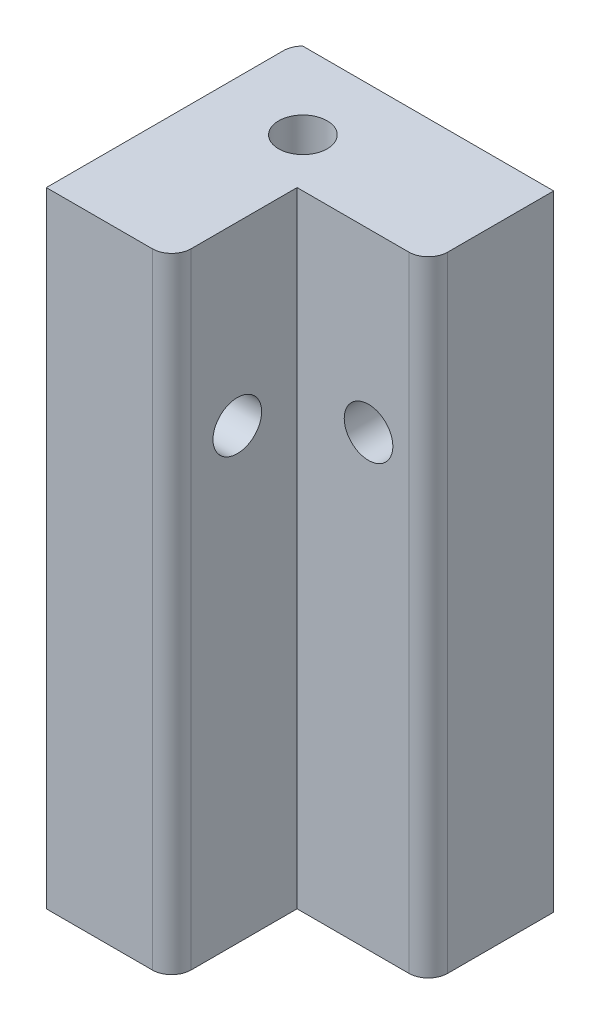
ISO-10303-21;
HEADER;
FILE_DESCRIPTION(('STEP AP214'),'2;1');
FILE_NAME('part.step','',(''),(''),'','','');
FILE_SCHEMA(('AUTOMOTIVE_DESIGN { 1 0 10303 214 1 1 1 1 }'));
ENDSEC;
DATA;
#1=APPLICATION_CONTEXT('core data for automotive mechanical design processes');
#2=APPLICATION_PROTOCOL_DEFINITION('international standard','automotive_design',2000,#1);
#3=PRODUCT_CONTEXT('',#1,'mechanical');
#4=PRODUCT('Part','Part','',(#3));
#5=PRODUCT_RELATED_PRODUCT_CATEGORY('part','',(#4));
#6=PRODUCT_DEFINITION_FORMATION('','',#4);
#7=PRODUCT_DEFINITION_CONTEXT('part definition',#1,'design');
#8=PRODUCT_DEFINITION('design','',#6,#7);
#9=PRODUCT_DEFINITION_SHAPE('','',#8);
#10=(LENGTH_UNIT() NAMED_UNIT(*) SI_UNIT(.MILLI.,.METRE.));
#11=(NAMED_UNIT(*) PLANE_ANGLE_UNIT() SI_UNIT($,.RADIAN.));
#12=(NAMED_UNIT(*) SI_UNIT($,.STERADIAN.) SOLID_ANGLE_UNIT());
#13=UNCERTAINTY_MEASURE_WITH_UNIT(LENGTH_MEASURE(1.E-05),#10,'distance_accuracy_value','');
#14=(GEOMETRIC_REPRESENTATION_CONTEXT(3) GLOBAL_UNCERTAINTY_ASSIGNED_CONTEXT((#13)) GLOBAL_UNIT_ASSIGNED_CONTEXT((#10,
#11,#12)) REPRESENTATION_CONTEXT('',''));
#15=CARTESIAN_POINT('',(0.,0.,0.));
#16=DIRECTION('',(0.,0.,1.));
#17=DIRECTION('',(1.,0.,0.));
#18=AXIS2_PLACEMENT_3D('',#15,#16,#17);
#19=CARTESIAN_POINT('',(4.4,82.5133549546154,-8.5));
#20=DIRECTION('',(-1.,0.,0.));
#21=DIRECTION('',(0.,0.,1.));
#22=AXIS2_PLACEMENT_3D('',#19,#20,#21);
#23=PLANE('',#22);
#24=CARTESIAN_POINT('',(4.4,46.1350000000003,11.15));
#25=DIRECTION('',(-1.,0.,0.));
#26=DIRECTION('',(0.,0.,1.));
#27=AXIS2_PLACEMENT_3D('',#24,#25,#26);
#28=CIRCLE('',#27,2.5);
#29=CARTESIAN_POINT('',(4.4,46.1350000000003,13.65));
#30=VERTEX_POINT('',#29);
#31=EDGE_CURVE('E173',#30,#30,#28,.T.);
#32=ORIENTED_EDGE('',*,*,#31,.T.);
#33=EDGE_LOOP('',(#32));
#34=FACE_BOUND('',#33,.T.);
#35=DIRECTION('',(0.,-1.,0.));
#36=VECTOR('',#35,1.);
#37=CARTESIAN_POINT('',(4.4,64.2700000000025,5.));
#38=LINE('',#37,#36);
#39=CARTESIAN_POINT('',(4.4,64.2700000000025,5.));
#40=VERTEX_POINT('',#39);
#41=CARTESIAN_POINT('',(4.4,0.,4.99999999999999));
#42=VERTEX_POINT('',#41);
#43=EDGE_CURVE('E159',#40,#42,#38,.T.);
#44=ORIENTED_EDGE('',*,*,#43,.F.);
#45=DIRECTION('',(0.,0.,1.));
#46=VECTOR('',#45,1.);
#47=CARTESIAN_POINT('',(4.4,64.2700000000025,-8.50000000000006));
#48=LINE('',#47,#46);
#49=CARTESIAN_POINT('',(4.4,64.2700000000024,15.9));
#50=VERTEX_POINT('',#49);
#51=EDGE_CURVE('E194',#40,#50,#48,.T.);
#52=ORIENTED_EDGE('',*,*,#51,.T.);
#53=DIRECTION('',(0.,1.,0.));
#54=VECTOR('',#53,1.);
#55=CARTESIAN_POINT('',(4.4,82.5133549546154,15.9));
#56=LINE('',#55,#54);
#57=CARTESIAN_POINT('',(4.4,0.,15.9));
#58=VERTEX_POINT('',#57);
#59=EDGE_CURVE('E219',#50,#58,#56,.F.);
#60=ORIENTED_EDGE('',*,*,#59,.T.);
#61=DIRECTION('',(0.,0.,-1.));
#62=VECTOR('',#61,1.);
#63=CARTESIAN_POINT('',(4.4,0.,-8.5));
#64=LINE('',#63,#62);
#65=EDGE_CURVE('E189',#58,#42,#64,.T.);
#66=ORIENTED_EDGE('',*,*,#65,.T.);
#67=EDGE_LOOP('',(#44,#52,#60,#66));
#68=FACE_BOUND('',#67,.T.);
#69=ADVANCED_FACE('F40',(#34,#68),#23,.F.);
#70=CARTESIAN_POINT('',(0.,0.,0.));
#71=DIRECTION('',(0.,-1.,0.));
#72=DIRECTION('',(0.,0.,-1.));
#73=AXIS2_PLACEMENT_3D('',#70,#71,#72);
#74=PLANE('',#73);
#75=DIRECTION('',(1.,0.,0.));
#76=VECTOR('',#75,1.);
#77=CARTESIAN_POINT('',(17.9000000000003,0.,-7.90000000000023));
#78=LINE('',#77,#76);
#79=CARTESIAN_POINT('',(-7.92828568570863,0.,-7.90000000000022));
#80=VERTEX_POINT('',#79);
#81=CARTESIAN_POINT('',(17.9000000000003,0.,-7.90000000000023));
#82=VERTEX_POINT('',#81);
#83=EDGE_CURVE('E129',#80,#82,#78,.T.);
#84=ORIENTED_EDGE('',*,*,#83,.T.);
#85=DIRECTION('',(0.,0.,-1.));
#86=VECTOR('',#85,1.);
#87=CARTESIAN_POINT('',(17.9,0.,-8.5));
#88=LINE('',#87,#86);
#89=CARTESIAN_POINT('',(17.9,0.,2.99999999999999));
#90=VERTEX_POINT('',#89);
#91=EDGE_CURVE('E141',#90,#82,#88,.T.);
#92=ORIENTED_EDGE('',*,*,#91,.F.);
#93=CARTESIAN_POINT('',(15.9,0.,2.99999999999999));
#94=DIRECTION('',(0.,-1.,0.));
#95=DIRECTION('',(0.,0.,-1.));
#96=AXIS2_PLACEMENT_3D('',#93,#94,#95);
#97=CIRCLE('',#96,2.);
#98=CARTESIAN_POINT('',(15.9,0.,4.99999999999999));
#99=VERTEX_POINT('',#98);
#100=EDGE_CURVE('E233',#90,#99,#97,.T.);
#101=ORIENTED_EDGE('',*,*,#100,.T.);
#102=DIRECTION('',(-1.,0.,0.));
#103=VECTOR('',#102,1.);
#104=CARTESIAN_POINT('',(17.9,0.,4.99999999999999));
#105=LINE('',#104,#103);
#106=EDGE_CURVE('E151',#99,#42,#105,.T.);
#107=ORIENTED_EDGE('',*,*,#106,.T.);
#108=ORIENTED_EDGE('',*,*,#65,.F.);
#109=CARTESIAN_POINT('',(2.4,0.,15.9));
#110=DIRECTION('',(0.,-1.,0.));
#111=DIRECTION('',(0.,0.,-1.));
#112=AXIS2_PLACEMENT_3D('',#109,#110,#111);
#113=CIRCLE('',#112,2.);
#114=CARTESIAN_POINT('',(2.4,0.,17.9));
#115=VERTEX_POINT('',#114);
#116=EDGE_CURVE('E224',#58,#115,#113,.T.);
#117=ORIENTED_EDGE('',*,*,#116,.T.);
#118=DIRECTION('',(1.,0.,0.));
#119=VECTOR('',#118,1.);
#120=CARTESIAN_POINT('',(4.4,0.,17.9));
#121=LINE('',#120,#119);
#122=CARTESIAN_POINT('',(-8.5,0.,17.9));
#123=VERTEX_POINT('',#122);
#124=EDGE_CURVE('E181',#123,#115,#121,.T.);
#125=ORIENTED_EDGE('',*,*,#124,.F.);
#126=DIRECTION('',(0.,0.,1.));
#127=VECTOR('',#126,1.);
#128=CARTESIAN_POINT('',(-8.5,0.,4.4));
#129=LINE('',#128,#127);
#130=CARTESIAN_POINT('',(-8.5,0.,-6.5));
#131=VERTEX_POINT('',#130);
#132=EDGE_CURVE('E195',#131,#123,#129,.T.);
#133=ORIENTED_EDGE('',*,*,#132,.F.);
#134=CARTESIAN_POINT('',(-6.5,0.,-6.5));
#135=DIRECTION('',(0.,-1.,0.));
#136=DIRECTION('',(0.,0.,-1.));
#137=AXIS2_PLACEMENT_3D('',#134,#135,#136);
#138=CIRCLE('',#137,2.);
#139=EDGE_CURVE('E143',#131,#80,#138,.T.);
#140=ORIENTED_EDGE('',*,*,#139,.T.);
#141=EDGE_LOOP('',(#84,#92,#101,#107,#108,#117,#125,#133,#140));
#142=FACE_BOUND('',#141,.T.);
#143=CARTESIAN_POINT('',(0.,0.,0.));
#144=DIRECTION('',(0.,1.,0.));
#145=DIRECTION('',(0.,0.,1.));
#146=AXIS2_PLACEMENT_3D('',#143,#144,#145);
#147=CIRCLE('',#146,2.5);
#148=CARTESIAN_POINT('',(0.,0.,2.5));
#149=VERTEX_POINT('',#148);
#150=EDGE_CURVE('E188',#149,#149,#147,.T.);
#151=ORIENTED_EDGE('',*,*,#150,.T.);
#152=EDGE_LOOP('',(#151));
#153=FACE_BOUND('',#152,.T.);
#154=ADVANCED_FACE('F139',(#142,#153),#74,.T.);
#155=CARTESIAN_POINT('',(-8.5,82.5133549546154,4.4));
#156=DIRECTION('',(1.,0.,0.));
#157=DIRECTION('',(0.,0.,-1.));
#158=AXIS2_PLACEMENT_3D('',#155,#156,#157);
#159=PLANE('',#158);
#160=CARTESIAN_POINT('',(-8.5,46.1350000000003,11.15));
#161=DIRECTION('',(-1.,0.,0.));
#162=DIRECTION('',(0.,0.,1.));
#163=AXIS2_PLACEMENT_3D('',#160,#161,#162);
#164=CIRCLE('',#163,2.5);
#165=CARTESIAN_POINT('',(-8.5,46.1350000000003,13.65));
#166=VERTEX_POINT('',#165);
#167=EDGE_CURVE('E169',#166,#166,#164,.T.);
#168=ORIENTED_EDGE('',*,*,#167,.F.);
#169=EDGE_LOOP('',(#168));
#170=FACE_BOUND('',#169,.T.);
#171=DIRECTION('',(0.,0.,-1.));
#172=VECTOR('',#171,1.);
#173=CARTESIAN_POINT('',(-8.5,64.2700000000024,4.39999999999994));
#174=LINE('',#173,#172);
#175=CARTESIAN_POINT('',(-8.5,64.2700000000024,17.9));
#176=VERTEX_POINT('',#175);
#177=CARTESIAN_POINT('',(-8.5,64.2700000000025,-6.5));
#178=VERTEX_POINT('',#177);
#179=EDGE_CURVE('E198',#176,#178,#174,.T.);
#180=ORIENTED_EDGE('',*,*,#179,.T.);
#181=DIRECTION('',(0.,-1.,0.));
#182=VECTOR('',#181,1.);
#183=CARTESIAN_POINT('',(-8.5,82.5133549546154,-6.5));
#184=LINE('',#183,#182);
#185=EDGE_CURVE('E227',#178,#131,#184,.T.);
#186=ORIENTED_EDGE('',*,*,#185,.T.);
#187=ORIENTED_EDGE('',*,*,#132,.T.);
#188=DIRECTION('',(0.,-1.,0.));
#189=VECTOR('',#188,1.);
#190=CARTESIAN_POINT('',(-8.5,0.,17.9));
#191=LINE('',#190,#189);
#192=EDGE_CURVE('E177',#176,#123,#191,.T.);
#193=ORIENTED_EDGE('',*,*,#192,.F.);
#194=EDGE_LOOP('',(#180,#186,#187,#193));
#195=FACE_BOUND('',#194,.T.);
#196=ADVANCED_FACE('F265',(#170,#195),#159,.F.);
#197=CARTESIAN_POINT('',(0.,82.5133549546154,0.));
#198=DIRECTION('',(0.,-1.,0.));
#199=DIRECTION('',(0.,0.,-1.));
#200=AXIS2_PLACEMENT_3D('',#197,#198,#199);
#201=CYLINDRICAL_SURFACE('',#200,2.5);
#202=CARTESIAN_POINT('',(0.,64.2700000000025,0.));
#203=DIRECTION('',(0.,-1.,0.));
#204=DIRECTION('',(0.,0.,-1.));
#205=AXIS2_PLACEMENT_3D('',#202,#203,#204);
#206=CIRCLE('',#205,2.5);
#207=CARTESIAN_POINT('',(0.,64.2700000000025,-2.5));
#208=VERTEX_POINT('',#207);
#209=EDGE_CURVE('E193',#208,#208,#206,.T.);
#210=ORIENTED_EDGE('',*,*,#209,.F.);
#211=EDGE_LOOP('',(#210));
#212=FACE_BOUND('',#211,.T.);
#213=ORIENTED_EDGE('',*,*,#150,.F.);
#214=EDGE_LOOP('',(#213));
#215=FACE_BOUND('',#214,.T.);
#216=ADVANCED_FACE('F272',(#212,#215),#201,.F.);
#217=CARTESIAN_POINT('',(-5.03553390591879,64.2700000000017,230.321777316259));
#218=DIRECTION('',(0.,-1.,0.));
#219=DIRECTION('',(-1.,0.,0.));
#220=AXIS2_PLACEMENT_3D('',#217,#218,#219);
#221=PLANE('',#220);
#222=ORIENTED_EDGE('',*,*,#209,.T.);
#223=EDGE_LOOP('',(#222));
#224=FACE_BOUND('',#223,.T.);
#225=DIRECTION('',(0.,0.,1.));
#226=VECTOR('',#225,1.);
#227=CARTESIAN_POINT('',(17.9,64.2700000000025,-8.5));
#228=LINE('',#227,#226);
#229=CARTESIAN_POINT('',(17.9,64.2700000000025,-7.90000000000011));
#230=VERTEX_POINT('',#229);
#231=CARTESIAN_POINT('',(17.9,64.2700000000025,3.));
#232=VERTEX_POINT('',#231);
#233=EDGE_CURVE('E152',#230,#232,#228,.T.);
#234=ORIENTED_EDGE('',*,*,#233,.F.);
#235=DIRECTION('',(1.,0.,0.));
#236=VECTOR('',#235,1.);
#237=CARTESIAN_POINT('',(17.9,64.2700000000026,-7.9));
#238=LINE('',#237,#236);
#239=CARTESIAN_POINT('',(-7.92828568570863,64.2700000000025,-7.9));
#240=VERTEX_POINT('',#239);
#241=EDGE_CURVE('E57',#240,#230,#238,.T.);
#242=ORIENTED_EDGE('',*,*,#241,.F.);
#243=CARTESIAN_POINT('',(-6.5,64.2700000000025,-6.5));
#244=DIRECTION('',(0.,-1.,0.));
#245=DIRECTION('',(0.,0.,-1.));
#246=AXIS2_PLACEMENT_3D('',#243,#244,#245);
#247=CIRCLE('',#246,2.);
#248=EDGE_CURVE('E213',#240,#178,#247,.F.);
#249=ORIENTED_EDGE('',*,*,#248,.T.);
#250=ORIENTED_EDGE('',*,*,#179,.F.);
#251=DIRECTION('',(-1.,0.,0.));
#252=VECTOR('',#251,1.);
#253=CARTESIAN_POINT('',(-8.5,64.2700000000024,17.9));
#254=LINE('',#253,#252);
#255=CARTESIAN_POINT('',(2.4,64.2700000000025,17.9));
#256=VERTEX_POINT('',#255);
#257=EDGE_CURVE('E185',#256,#176,#254,.T.);
#258=ORIENTED_EDGE('',*,*,#257,.F.);
#259=CARTESIAN_POINT('',(2.4,64.2700000000024,15.9));
#260=DIRECTION('',(0.,-1.,0.));
#261=DIRECTION('',(0.,0.,-1.));
#262=AXIS2_PLACEMENT_3D('',#259,#260,#261);
#263=CIRCLE('',#262,2.);
#264=EDGE_CURVE('E215',#256,#50,#263,.F.);
#265=ORIENTED_EDGE('',*,*,#264,.T.);
#266=ORIENTED_EDGE('',*,*,#51,.F.);
#267=DIRECTION('',(-1.,0.,0.));
#268=VECTOR('',#267,1.);
#269=CARTESIAN_POINT('',(17.9,64.2700000000025,5.));
#270=LINE('',#269,#268);
#271=CARTESIAN_POINT('',(15.9,64.2700000000025,5.));
#272=VERTEX_POINT('',#271);
#273=EDGE_CURVE('E156',#272,#40,#270,.T.);
#274=ORIENTED_EDGE('',*,*,#273,.F.);
#275=CARTESIAN_POINT('',(15.9,64.2700000000025,3.));
#276=DIRECTION('',(0.,-1.,0.));
#277=DIRECTION('',(0.,0.,-1.));
#278=AXIS2_PLACEMENT_3D('',#275,#276,#277);
#279=CIRCLE('',#278,2.);
#280=EDGE_CURVE('E11',#272,#232,#279,.F.);
#281=ORIENTED_EDGE('',*,*,#280,.T.);
#282=EDGE_LOOP('',(#234,#242,#249,#250,#258,#265,#266,#274,#281));
#283=FACE_BOUND('',#282,.T.);
#284=ADVANCED_FACE('F276',(#224,#283),#221,.F.);
#285=CARTESIAN_POINT('',(0.,0.,17.9));
#286=DIRECTION('',(0.,0.,-1.));
#287=DIRECTION('',(-1.,0.,0.));
#288=AXIS2_PLACEMENT_3D('',#285,#286,#287);
#289=PLANE('',#288);
#290=ORIENTED_EDGE('',*,*,#124,.T.);
#291=DIRECTION('',(0.,1.,0.));
#292=VECTOR('',#291,1.);
#293=CARTESIAN_POINT('',(2.4,0.,17.9));
#294=LINE('',#293,#292);
#295=EDGE_CURVE('E209',#115,#256,#294,.T.);
#296=ORIENTED_EDGE('',*,*,#295,.T.);
#297=ORIENTED_EDGE('',*,*,#257,.T.);
#298=ORIENTED_EDGE('',*,*,#192,.T.);
#299=EDGE_LOOP('',(#290,#296,#297,#298));
#300=FACE_BOUND('',#299,.T.);
#301=ADVANCED_FACE('F280',(#300),#289,.F.);
#302=CARTESIAN_POINT('',(2.4,0.,15.9));
#303=DIRECTION('',(0.,1.,0.));
#304=DIRECTION('',(0.,0.,1.));
#305=AXIS2_PLACEMENT_3D('',#302,#303,#304);
#306=CYLINDRICAL_SURFACE('',#305,2.);
#307=ORIENTED_EDGE('',*,*,#116,.F.);
#308=ORIENTED_EDGE('',*,*,#59,.F.);
#309=ORIENTED_EDGE('',*,*,#264,.F.);
#310=ORIENTED_EDGE('',*,*,#295,.F.);
#311=EDGE_LOOP('',(#307,#308,#309,#310));
#312=FACE_BOUND('',#311,.T.);
#313=ADVANCED_FACE('F282',(#312),#306,.T.);
#314=CARTESIAN_POINT('',(-6.5,82.5133549546154,-6.5));
#315=DIRECTION('',(0.,-1.,0.));
#316=DIRECTION('',(0.,0.,-1.));
#317=AXIS2_PLACEMENT_3D('',#314,#315,#316);
#318=CYLINDRICAL_SURFACE('',#317,2.);
#319=DIRECTION('',(0.,-1.,0.));
#320=VECTOR('',#319,1.);
#321=CARTESIAN_POINT('',(-7.92828568570863,82.5133549546154,-7.89999999999994));
#322=LINE('',#321,#320);
#323=EDGE_CURVE('E238',#80,#240,#322,.F.);
#324=ORIENTED_EDGE('',*,*,#323,.F.);
#325=ORIENTED_EDGE('',*,*,#139,.F.);
#326=ORIENTED_EDGE('',*,*,#185,.F.);
#327=ORIENTED_EDGE('',*,*,#248,.F.);
#328=EDGE_LOOP('',(#324,#325,#326,#327));
#329=FACE_BOUND('',#328,.T.);
#330=ADVANCED_FACE('F284',(#329),#318,.T.);
#331=CARTESIAN_POINT('',(5.,46.1350000000003,11.15));
#332=DIRECTION('',(-1.,0.,0.));
#333=DIRECTION('',(0.,0.,1.));
#334=AXIS2_PLACEMENT_3D('',#331,#332,#333);
#335=CYLINDRICAL_SURFACE('',#334,2.5);
#336=ORIENTED_EDGE('',*,*,#31,.F.);
#337=EDGE_LOOP('',(#336));
#338=FACE_BOUND('',#337,.T.);
#339=ORIENTED_EDGE('',*,*,#167,.T.);
#340=EDGE_LOOP('',(#339));
#341=FACE_BOUND('',#340,.T.);
#342=ADVANCED_FACE('F287',(#338,#341),#335,.F.);
#343=CARTESIAN_POINT('',(17.9,64.2700000000025,5.));
#344=DIRECTION('',(0.,0.,-1.));
#345=DIRECTION('',(0.,1.,0.));
#346=AXIS2_PLACEMENT_3D('',#343,#344,#345);
#347=PLANE('',#346);
#348=CARTESIAN_POINT('',(11.75,46.1350000000025,5.));
#349=DIRECTION('',(0.,0.,-1.));
#350=DIRECTION('',(-1.,0.,0.));
#351=AXIS2_PLACEMENT_3D('',#348,#349,#350);
#352=CIRCLE('',#351,2.5);
#353=CARTESIAN_POINT('',(9.25,46.1350000000025,5.));
#354=VERTEX_POINT('',#353);
#355=EDGE_CURVE('E165',#354,#354,#352,.T.);
#356=ORIENTED_EDGE('',*,*,#355,.T.);
#357=EDGE_LOOP('',(#356));
#358=FACE_BOUND('',#357,.T.);
#359=ORIENTED_EDGE('',*,*,#106,.F.);
#360=DIRECTION('',(0.,-1.,0.));
#361=VECTOR('',#360,1.);
#362=CARTESIAN_POINT('',(15.9,64.2700000000025,5.));
#363=LINE('',#362,#361);
#364=EDGE_CURVE('E50',#99,#272,#363,.F.);
#365=ORIENTED_EDGE('',*,*,#364,.T.);
#366=ORIENTED_EDGE('',*,*,#273,.T.);
#367=ORIENTED_EDGE('',*,*,#43,.T.);
#368=EDGE_LOOP('',(#359,#365,#366,#367));
#369=FACE_BOUND('',#368,.T.);
#370=ADVANCED_FACE('F245',(#358,#369),#347,.F.);
#371=CARTESIAN_POINT('',(17.9,0.,0.));
#372=DIRECTION('',(-1.,0.,0.));
#373=DIRECTION('',(0.,0.,1.));
#374=AXIS2_PLACEMENT_3D('',#371,#372,#373);
#375=PLANE('',#374);
#376=ORIENTED_EDGE('',*,*,#91,.T.);
#377=DIRECTION('',(0.,1.,0.));
#378=VECTOR('',#377,1.);
#379=CARTESIAN_POINT('',(17.9000000000003,-26.4068173015984,-7.90000000000032));
#380=LINE('',#379,#378);
#381=EDGE_CURVE('E125',#82,#230,#380,.T.);
#382=ORIENTED_EDGE('',*,*,#381,.T.);
#383=ORIENTED_EDGE('',*,*,#233,.T.);
#384=DIRECTION('',(0.,-1.,0.));
#385=VECTOR('',#384,1.);
#386=CARTESIAN_POINT('',(17.9,0.,2.99999999999999));
#387=LINE('',#386,#385);
#388=EDGE_CURVE('E149',#232,#90,#387,.T.);
#389=ORIENTED_EDGE('',*,*,#388,.T.);
#390=EDGE_LOOP('',(#376,#382,#383,#389));
#391=FACE_BOUND('',#390,.T.);
#392=ADVANCED_FACE('F147',(#391),#375,.F.);
#393=CARTESIAN_POINT('',(11.75,46.1350000000025,5.));
#394=DIRECTION('',(0.,0.,-1.));
#395=DIRECTION('',(-1.,0.,0.));
#396=AXIS2_PLACEMENT_3D('',#393,#394,#395);
#397=CYLINDRICAL_SURFACE('',#396,2.5);
#398=CARTESIAN_POINT('',(11.75,46.1350000000025,-7.90000000000007));
#399=DIRECTION('',(0.,0.,1.));
#400=DIRECTION('',(0.,-1.,0.));
#401=AXIS2_PLACEMENT_3D('',#398,#399,#400);
#402=CIRCLE('',#401,2.5);
#403=CARTESIAN_POINT('',(11.75,43.6350000000025,-7.90000000000007));
#404=VERTEX_POINT('',#403);
#405=EDGE_CURVE('E44',#404,#404,#402,.F.);
#406=ORIENTED_EDGE('',*,*,#405,.T.);
#407=EDGE_LOOP('',(#406));
#408=FACE_BOUND('',#407,.T.);
#409=ORIENTED_EDGE('',*,*,#355,.F.);
#410=EDGE_LOOP('',(#409));
#411=FACE_BOUND('',#410,.T.);
#412=ADVANCED_FACE('F247',(#408,#411),#397,.F.);
#413=CARTESIAN_POINT('',(15.9,0.,2.99999999999999));
#414=DIRECTION('',(0.,-1.,0.));
#415=DIRECTION('',(0.,0.,-1.));
#416=AXIS2_PLACEMENT_3D('',#413,#414,#415);
#417=CYLINDRICAL_SURFACE('',#416,2.);
#418=ORIENTED_EDGE('',*,*,#280,.F.);
#419=ORIENTED_EDGE('',*,*,#364,.F.);
#420=ORIENTED_EDGE('',*,*,#100,.F.);
#421=ORIENTED_EDGE('',*,*,#388,.F.);
#422=EDGE_LOOP('',(#418,#419,#420,#421));
#423=FACE_BOUND('',#422,.T.);
#424=ADVANCED_FACE('F42',(#423),#417,.T.);
#425=CARTESIAN_POINT('',(17.9000000000003,-26.4068173015984,-7.90000000000032));
#426=DIRECTION('',(0.,0.,1.));
#427=DIRECTION('',(0.,-1.,0.));
#428=AXIS2_PLACEMENT_3D('',#425,#426,#427);
#429=PLANE('',#428);
#430=ORIENTED_EDGE('',*,*,#323,.T.);
#431=ORIENTED_EDGE('',*,*,#241,.T.);
#432=ORIENTED_EDGE('',*,*,#381,.F.);
#433=ORIENTED_EDGE('',*,*,#83,.F.);
#434=EDGE_LOOP('',(#430,#431,#432,#433));
#435=FACE_BOUND('',#434,.T.);
#436=ORIENTED_EDGE('',*,*,#405,.F.);
#437=EDGE_LOOP('',(#436));
#438=FACE_BOUND('',#437,.T.);
#439=ADVANCED_FACE('F127',(#435,#438),#429,.F.);
#440=CLOSED_SHELL('',(#69,#154,#196,#216,#284,#301,#313,#330,#342,#370,#392,#412,#424,#439));
#441=MANIFOLD_SOLID_BREP('B2',#440);
#442=ADVANCED_BREP_SHAPE_REPRESENTATION('',(#18,#441),#14);
#443=SHAPE_DEFINITION_REPRESENTATION(#9,#442);
ENDSEC;
END-ISO-10303-21;
